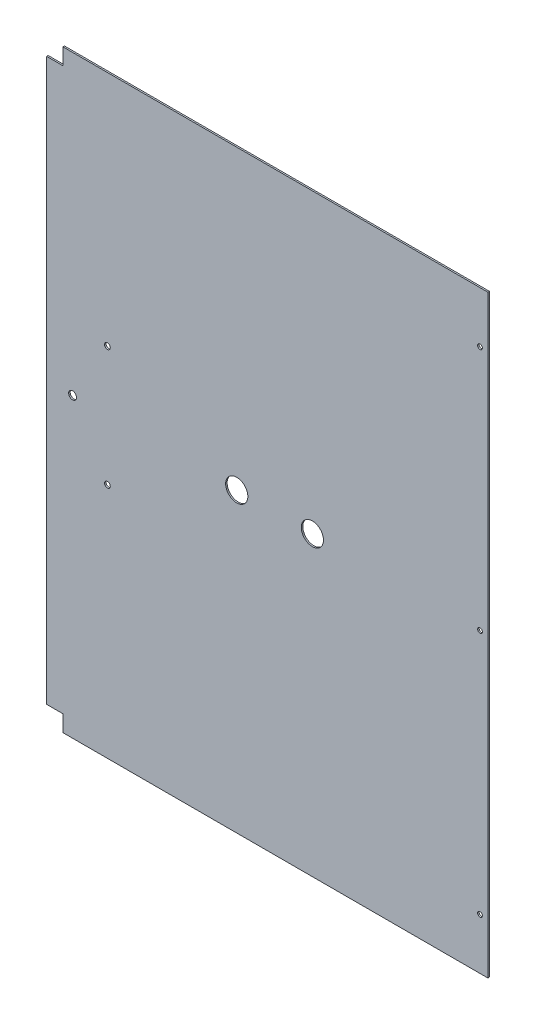
ISO-10303-21;
HEADER;
FILE_DESCRIPTION(('STEP AP214'),'2;1');
FILE_NAME('part.step','',(''),(''),'','','');
FILE_SCHEMA(('AUTOMOTIVE_DESIGN { 1 0 10303 214 1 1 1 1 }'));
ENDSEC;
DATA;
#1=APPLICATION_CONTEXT('core data for automotive mechanical design processes');
#2=APPLICATION_PROTOCOL_DEFINITION('international standard','automotive_design',2000,#1);
#3=PRODUCT_CONTEXT('',#1,'mechanical');
#4=PRODUCT('Part','Part','',(#3));
#5=PRODUCT_RELATED_PRODUCT_CATEGORY('part','',(#4));
#6=PRODUCT_DEFINITION_FORMATION('','',#4);
#7=PRODUCT_DEFINITION_CONTEXT('part definition',#1,'design');
#8=PRODUCT_DEFINITION('design','',#6,#7);
#9=PRODUCT_DEFINITION_SHAPE('','',#8);
#10=(LENGTH_UNIT() NAMED_UNIT(*) SI_UNIT(.MILLI.,.METRE.));
#11=(NAMED_UNIT(*) PLANE_ANGLE_UNIT() SI_UNIT($,.RADIAN.));
#12=(NAMED_UNIT(*) SI_UNIT($,.STERADIAN.) SOLID_ANGLE_UNIT());
#13=UNCERTAINTY_MEASURE_WITH_UNIT(LENGTH_MEASURE(1.E-05),#10,'distance_accuracy_value','');
#14=(GEOMETRIC_REPRESENTATION_CONTEXT(3) GLOBAL_UNCERTAINTY_ASSIGNED_CONTEXT((#13)) GLOBAL_UNIT_ASSIGNED_CONTEXT((#10,
#11,#12)) REPRESENTATION_CONTEXT('',''));
#15=CARTESIAN_POINT('',(0.,0.,0.));
#16=DIRECTION('',(0.,0.,1.));
#17=DIRECTION('',(1.,0.,0.));
#18=AXIS2_PLACEMENT_3D('',#15,#16,#17);
#19=CARTESIAN_POINT('',(0.,0.,-1.524));
#20=DIRECTION('',(0.,0.,-1.));
#21=DIRECTION('',(-1.,0.,0.));
#22=AXIS2_PLACEMENT_3D('',#19,#20,#21);
#23=PLANE('',#22);
#24=CARTESIAN_POINT('',(-202.819,0.,-1.524));
#25=DIRECTION('',(0.,0.,-1.));
#26=DIRECTION('',(-1.,0.,0.));
#27=AXIS2_PLACEMENT_3D('',#24,#25,#26);
#28=CIRCLE('',#27,3.9624);
#29=CARTESIAN_POINT('',(-206.7814,0.,-1.524));
#30=VERTEX_POINT('',#29);
#31=EDGE_CURVE('E311',#30,#30,#28,.T.);
#32=ORIENTED_EDGE('',*,*,#31,.F.);
#33=EDGE_LOOP('',(#32));
#34=FACE_BOUND('',#33,.T.);
#35=CARTESIAN_POINT('',(-167.767,60.452,-1.524));
#36=DIRECTION('',(0.,0.,-1.));
#37=DIRECTION('',(-1.,0.,0.));
#38=AXIS2_PLACEMENT_3D('',#35,#36,#37);
#39=CIRCLE('',#38,2.8956);
#40=CARTESIAN_POINT('',(-170.6626,60.452,-1.524));
#41=VERTEX_POINT('',#40);
#42=EDGE_CURVE('E435',#41,#41,#39,.T.);
#43=ORIENTED_EDGE('',*,*,#42,.F.);
#44=EDGE_LOOP('',(#43));
#45=FACE_BOUND('',#44,.T.);
#46=CARTESIAN_POINT('',(-167.767,-60.452,-1.524));
#47=DIRECTION('',(0.,0.,-1.));
#48=DIRECTION('',(-1.,0.,0.));
#49=AXIS2_PLACEMENT_3D('',#46,#47,#48);
#50=CIRCLE('',#49,2.8956);
#51=CARTESIAN_POINT('',(-170.6626,-60.452,-1.524));
#52=VERTEX_POINT('',#51);
#53=EDGE_CURVE('E431',#52,#52,#50,.T.);
#54=ORIENTED_EDGE('',*,*,#53,.F.);
#55=EDGE_LOOP('',(#54));
#56=FACE_BOUND('',#55,.T.);
#57=CARTESIAN_POINT('',(38.7349999999999,0.,-1.524));
#58=DIRECTION('',(0.,0.,-1.));
#59=DIRECTION('',(-1.,0.,0.));
#60=AXIS2_PLACEMENT_3D('',#57,#58,#59);
#61=CIRCLE('',#60,11.176);
#62=CARTESIAN_POINT('',(27.5589999999999,0.,-1.524));
#63=VERTEX_POINT('',#62);
#64=EDGE_CURVE('E427',#63,#63,#61,.T.);
#65=ORIENTED_EDGE('',*,*,#64,.F.);
#66=EDGE_LOOP('',(#65));
#67=FACE_BOUND('',#66,.T.);
#68=CARTESIAN_POINT('',(-37.4650000000002,0.,-1.524));
#69=DIRECTION('',(0.,0.,-1.));
#70=DIRECTION('',(-1.,0.,0.));
#71=AXIS2_PLACEMENT_3D('',#68,#69,#70);
#72=CIRCLE('',#71,11.176);
#73=CARTESIAN_POINT('',(-48.6410000000001,0.,-1.524));
#74=VERTEX_POINT('',#73);
#75=EDGE_CURVE('E423',#74,#74,#72,.T.);
#76=ORIENTED_EDGE('',*,*,#75,.F.);
#77=EDGE_LOOP('',(#76));
#78=FACE_BOUND('',#77,.T.);
#79=CARTESIAN_POINT('',(207.645,0.,-1.524));
#80=DIRECTION('',(0.,0.,-1.));
#81=DIRECTION('',(-1.,0.,0.));
#82=AXIS2_PLACEMENT_3D('',#79,#80,#81);
#83=CIRCLE('',#82,2.413);
#84=CARTESIAN_POINT('',(205.232,0.,-1.524));
#85=VERTEX_POINT('',#84);
#86=EDGE_CURVE('E419',#85,#85,#83,.T.);
#87=ORIENTED_EDGE('',*,*,#86,.F.);
#88=EDGE_LOOP('',(#87));
#89=FACE_BOUND('',#88,.T.);
#90=CARTESIAN_POINT('',(207.645,247.65,-1.524));
#91=DIRECTION('',(0.,0.,-1.));
#92=DIRECTION('',(-1.,0.,0.));
#93=AXIS2_PLACEMENT_3D('',#90,#91,#92);
#94=CIRCLE('',#93,2.413);
#95=CARTESIAN_POINT('',(205.232,247.65,-1.524));
#96=VERTEX_POINT('',#95);
#97=EDGE_CURVE('E415',#96,#96,#94,.T.);
#98=ORIENTED_EDGE('',*,*,#97,.F.);
#99=EDGE_LOOP('',(#98));
#100=FACE_BOUND('',#99,.T.);
#101=CARTESIAN_POINT('',(207.645,-247.65,-1.524));
#102=DIRECTION('',(0.,0.,-1.));
#103=DIRECTION('',(-1.,0.,0.));
#104=AXIS2_PLACEMENT_3D('',#101,#102,#103);
#105=CIRCLE('',#104,2.413);
#106=CARTESIAN_POINT('',(205.232,-247.65,-1.524));
#107=VERTEX_POINT('',#106);
#108=EDGE_CURVE('E384',#107,#107,#105,.T.);
#109=ORIENTED_EDGE('',*,*,#108,.F.);
#110=EDGE_LOOP('',(#109));
#111=FACE_BOUND('',#110,.T.);
#112=DIRECTION('',(0.,1.,0.));
#113=VECTOR('',#112,1.);
#114=CARTESIAN_POINT('',(215.519,-285.75,-1.524));
#115=LINE('',#114,#113);
#116=CARTESIAN_POINT('',(215.519,-299.198962531012,-1.52399999999991));
#117=VERTEX_POINT('',#116);
#118=CARTESIAN_POINT('',(215.519,299.198962531012,-1.52399999999986));
#119=VERTEX_POINT('',#118);
#120=EDGE_CURVE('E258',#117,#119,#115,.T.);
#121=ORIENTED_EDGE('',*,*,#120,.F.);
#122=DIRECTION('',(-1.,0.,0.));
#123=VECTOR('',#122,1.);
#124=CARTESIAN_POINT('',(0.,-299.198962531012,-1.52399999999991));
#125=LINE('',#124,#123);
#126=CARTESIAN_POINT('',(-212.471,-299.198962531012,-1.52399999999991));
#127=VERTEX_POINT('',#126);
#128=EDGE_CURVE('E367',#117,#127,#125,.T.);
#129=ORIENTED_EDGE('',*,*,#128,.T.);
#130=DIRECTION('',(0.,1.,0.));
#131=VECTOR('',#130,1.);
#132=CARTESIAN_POINT('',(-212.471,-284.473481265506,-1.52400000000006));
#133=LINE('',#132,#131);
#134=CARTESIAN_POINT('',(-212.471,-282.702,-1.52399999999998));
#135=VERTEX_POINT('',#134);
#136=EDGE_CURVE('E265',#127,#135,#133,.T.);
#137=ORIENTED_EDGE('',*,*,#136,.T.);
#138=DIRECTION('',(-1.,0.,0.));
#139=VECTOR('',#138,1.);
#140=CARTESIAN_POINT('',(-214.242481265506,-282.702,-1.52399999999998));
#141=LINE('',#140,#139);
#142=CARTESIAN_POINT('',(-228.967962531012,-282.702,-1.52399999999994));
#143=VERTEX_POINT('',#142);
#144=EDGE_CURVE('E272',#135,#143,#141,.T.);
#145=ORIENTED_EDGE('',*,*,#144,.T.);
#146=DIRECTION('',(0.,1.,0.));
#147=VECTOR('',#146,1.);
#148=CARTESIAN_POINT('',(-228.967962531012,0.,-1.52399999999991));
#149=LINE('',#148,#147);
#150=CARTESIAN_POINT('',(-228.967962531012,282.702,-1.52399999999989));
#151=VERTEX_POINT('',#150);
#152=EDGE_CURVE('E341',#143,#151,#149,.T.);
#153=ORIENTED_EDGE('',*,*,#152,.T.);
#154=DIRECTION('',(-1.,0.,0.));
#155=VECTOR('',#154,1.);
#156=CARTESIAN_POINT('',(-214.242481265506,282.702,-1.52399999999998));
#157=LINE('',#156,#155);
#158=CARTESIAN_POINT('',(-212.471,282.702,-1.52399999999998));
#159=VERTEX_POINT('',#158);
#160=EDGE_CURVE('E354',#151,#159,#157,.F.);
#161=ORIENTED_EDGE('',*,*,#160,.T.);
#162=DIRECTION('',(0.,1.,0.));
#163=VECTOR('',#162,1.);
#164=CARTESIAN_POINT('',(-212.471,284.473481265506,-1.52399999999998));
#165=LINE('',#164,#163);
#166=CARTESIAN_POINT('',(-212.471,299.198962531012,-1.52399999999986));
#167=VERTEX_POINT('',#166);
#168=EDGE_CURVE('E330',#159,#167,#165,.T.);
#169=ORIENTED_EDGE('',*,*,#168,.T.);
#170=DIRECTION('',(-1.,0.,0.));
#171=VECTOR('',#170,1.);
#172=CARTESIAN_POINT('',(0.,299.198962531012,-1.52399999999986));
#173=LINE('',#172,#171);
#174=EDGE_CURVE('E319',#167,#119,#173,.F.);
#175=ORIENTED_EDGE('',*,*,#174,.T.);
#176=EDGE_LOOP('',(#121,#129,#137,#145,#153,#161,#169,#175));
#177=FACE_BOUND('',#176,.T.);
#178=ADVANCED_FACE('F227',(#34,#45,#56,#67,#78,#89,#100,#111,#177),#23,.T.);
#179=CARTESIAN_POINT('',(0.,0.,0.));
#180=DIRECTION('',(0.,0.,-1.));
#181=DIRECTION('',(-1.,0.,0.));
#182=AXIS2_PLACEMENT_3D('',#179,#180,#181);
#183=PLANE('',#182);
#184=CARTESIAN_POINT('',(-202.819,0.,0.));
#185=DIRECTION('',(0.,0.,1.));
#186=DIRECTION('',(1.,0.,0.));
#187=AXIS2_PLACEMENT_3D('',#184,#185,#186);
#188=CIRCLE('',#187,3.9624);
#189=CARTESIAN_POINT('',(-198.8566,0.,0.));
#190=VERTEX_POINT('',#189);
#191=EDGE_CURVE('E380',#190,#190,#188,.T.);
#192=ORIENTED_EDGE('',*,*,#191,.F.);
#193=EDGE_LOOP('',(#192));
#194=FACE_BOUND('',#193,.T.);
#195=CARTESIAN_POINT('',(-167.767,60.452,0.));
#196=DIRECTION('',(0.,0.,1.));
#197=DIRECTION('',(1.,0.,0.));
#198=AXIS2_PLACEMENT_3D('',#195,#196,#197);
#199=CIRCLE('',#198,2.8956);
#200=CARTESIAN_POINT('',(-164.8714,60.452,0.));
#201=VERTEX_POINT('',#200);
#202=EDGE_CURVE('E385',#201,#201,#199,.T.);
#203=ORIENTED_EDGE('',*,*,#202,.F.);
#204=EDGE_LOOP('',(#203));
#205=FACE_BOUND('',#204,.T.);
#206=CARTESIAN_POINT('',(-167.767,-60.452,0.));
#207=DIRECTION('',(0.,0.,1.));
#208=DIRECTION('',(1.,0.,0.));
#209=AXIS2_PLACEMENT_3D('',#206,#207,#208);
#210=CIRCLE('',#209,2.8956);
#211=CARTESIAN_POINT('',(-164.8714,-60.452,0.));
#212=VERTEX_POINT('',#211);
#213=EDGE_CURVE('E389',#212,#212,#210,.T.);
#214=ORIENTED_EDGE('',*,*,#213,.F.);
#215=EDGE_LOOP('',(#214));
#216=FACE_BOUND('',#215,.T.);
#217=CARTESIAN_POINT('',(38.7349999999999,0.,0.));
#218=DIRECTION('',(0.,0.,1.));
#219=DIRECTION('',(1.,0.,0.));
#220=AXIS2_PLACEMENT_3D('',#217,#218,#219);
#221=CIRCLE('',#220,11.176);
#222=CARTESIAN_POINT('',(49.9109999999999,0.,0.));
#223=VERTEX_POINT('',#222);
#224=EDGE_CURVE('E393',#223,#223,#221,.T.);
#225=ORIENTED_EDGE('',*,*,#224,.F.);
#226=EDGE_LOOP('',(#225));
#227=FACE_BOUND('',#226,.T.);
#228=CARTESIAN_POINT('',(-37.4650000000002,0.,0.));
#229=DIRECTION('',(0.,0.,1.));
#230=DIRECTION('',(1.,0.,0.));
#231=AXIS2_PLACEMENT_3D('',#228,#229,#230);
#232=CIRCLE('',#231,11.176);
#233=CARTESIAN_POINT('',(-26.2890000000002,0.,0.));
#234=VERTEX_POINT('',#233);
#235=EDGE_CURVE('E397',#234,#234,#232,.T.);
#236=ORIENTED_EDGE('',*,*,#235,.F.);
#237=EDGE_LOOP('',(#236));
#238=FACE_BOUND('',#237,.T.);
#239=CARTESIAN_POINT('',(207.645,0.,0.));
#240=DIRECTION('',(0.,0.,1.));
#241=DIRECTION('',(1.,0.,0.));
#242=AXIS2_PLACEMENT_3D('',#239,#240,#241);
#243=CIRCLE('',#242,2.413);
#244=CARTESIAN_POINT('',(210.058,0.,0.));
#245=VERTEX_POINT('',#244);
#246=EDGE_CURVE('E401',#245,#245,#243,.T.);
#247=ORIENTED_EDGE('',*,*,#246,.F.);
#248=EDGE_LOOP('',(#247));
#249=FACE_BOUND('',#248,.T.);
#250=CARTESIAN_POINT('',(207.645,247.65,0.));
#251=DIRECTION('',(0.,0.,1.));
#252=DIRECTION('',(1.,0.,0.));
#253=AXIS2_PLACEMENT_3D('',#250,#251,#252);
#254=CIRCLE('',#253,2.413);
#255=CARTESIAN_POINT('',(210.058,247.65,0.));
#256=VERTEX_POINT('',#255);
#257=EDGE_CURVE('E405',#256,#256,#254,.T.);
#258=ORIENTED_EDGE('',*,*,#257,.F.);
#259=EDGE_LOOP('',(#258));
#260=FACE_BOUND('',#259,.T.);
#261=CARTESIAN_POINT('',(207.645,-247.65,0.));
#262=DIRECTION('',(0.,0.,1.));
#263=DIRECTION('',(1.,0.,0.));
#264=AXIS2_PLACEMENT_3D('',#261,#262,#263);
#265=CIRCLE('',#264,2.413);
#266=CARTESIAN_POINT('',(210.058,-247.65,0.));
#267=VERTEX_POINT('',#266);
#268=EDGE_CURVE('E377',#267,#267,#265,.T.);
#269=ORIENTED_EDGE('',*,*,#268,.F.);
#270=EDGE_LOOP('',(#269));
#271=FACE_BOUND('',#270,.T.);
#272=DIRECTION('',(-1.,0.,0.));
#273=VECTOR('',#272,1.);
#274=CARTESIAN_POINT('',(-214.242481265506,-282.702,0.));
#275=LINE('',#274,#273);
#276=CARTESIAN_POINT('',(-212.471,-282.702,0.));
#277=VERTEX_POINT('',#276);
#278=CARTESIAN_POINT('',(-228.967962531012,-282.702,0.));
#279=VERTEX_POINT('',#278);
#280=EDGE_CURVE('E340',#277,#279,#275,.T.);
#281=ORIENTED_EDGE('',*,*,#280,.F.);
#282=DIRECTION('',(0.,1.,0.));
#283=VECTOR('',#282,1.);
#284=CARTESIAN_POINT('',(-212.471,-284.473481265506,0.));
#285=LINE('',#284,#283);
#286=CARTESIAN_POINT('',(-212.471,-299.198962531012,1.11022302462516E-13));
#287=VERTEX_POINT('',#286);
#288=EDGE_CURVE('E245',#287,#277,#285,.T.);
#289=ORIENTED_EDGE('',*,*,#288,.F.);
#290=DIRECTION('',(1.,0.,0.));
#291=VECTOR('',#290,1.);
#292=CARTESIAN_POINT('',(215.519,-299.198962531012,1.11022302462516E-13));
#293=LINE('',#292,#291);
#294=CARTESIAN_POINT('',(215.519,-299.198962531012,1.11022302462516E-13));
#295=VERTEX_POINT('',#294);
#296=EDGE_CURVE('E307',#295,#287,#293,.F.);
#297=ORIENTED_EDGE('',*,*,#296,.F.);
#298=DIRECTION('',(0.,1.,0.));
#299=VECTOR('',#298,1.);
#300=CARTESIAN_POINT('',(215.519,-285.75,0.));
#301=LINE('',#300,#299);
#302=CARTESIAN_POINT('',(215.519,299.198962531012,1.66533453693773E-13));
#303=VERTEX_POINT('',#302);
#304=EDGE_CURVE('E301',#295,#303,#301,.T.);
#305=ORIENTED_EDGE('',*,*,#304,.T.);
#306=DIRECTION('',(1.,0.,0.));
#307=VECTOR('',#306,1.);
#308=CARTESIAN_POINT('',(215.519,299.198962531012,1.66533453693773E-13));
#309=LINE('',#308,#307);
#310=CARTESIAN_POINT('',(-212.471,299.198962531012,1.66533453693773E-13));
#311=VERTEX_POINT('',#310);
#312=EDGE_CURVE('E305',#311,#303,#309,.T.);
#313=ORIENTED_EDGE('',*,*,#312,.F.);
#314=DIRECTION('',(0.,1.,0.));
#315=VECTOR('',#314,1.);
#316=CARTESIAN_POINT('',(-212.471,284.473481265506,0.));
#317=LINE('',#316,#315);
#318=CARTESIAN_POINT('',(-212.471,282.702,0.));
#319=VERTEX_POINT('',#318);
#320=EDGE_CURVE('E334',#319,#311,#317,.T.);
#321=ORIENTED_EDGE('',*,*,#320,.F.);
#322=DIRECTION('',(-1.,0.,0.));
#323=VECTOR('',#322,1.);
#324=CARTESIAN_POINT('',(-214.242481265506,282.702,0.));
#325=LINE('',#324,#323);
#326=CARTESIAN_POINT('',(-228.967962531012,282.702,1.38777878078145E-13));
#327=VERTEX_POINT('',#326);
#328=EDGE_CURVE('E355',#327,#319,#325,.F.);
#329=ORIENTED_EDGE('',*,*,#328,.F.);
#330=DIRECTION('',(0.,-1.,0.));
#331=VECTOR('',#330,1.);
#332=CARTESIAN_POINT('',(-228.967962531012,-282.702,0.));
#333=LINE('',#332,#331);
#334=EDGE_CURVE('E333',#279,#327,#333,.F.);
#335=ORIENTED_EDGE('',*,*,#334,.F.);
#336=EDGE_LOOP('',(#281,#289,#297,#305,#313,#321,#329,#335));
#337=FACE_BOUND('',#336,.T.);
#338=ADVANCED_FACE('F229',(#194,#205,#216,#227,#238,#249,#260,#271,#337),#183,.F.);
#339=CARTESIAN_POINT('',(215.519,-285.75,-1.524));
#340=DIRECTION('',(1.,0.,0.));
#341=DIRECTION('',(0.,0.,-1.));
#342=AXIS2_PLACEMENT_3D('',#339,#340,#341);
#343=PLANE('',#342);
#344=ORIENTED_EDGE('',*,*,#304,.F.);
#345=DIRECTION('',(0.,0.,-1.));
#346=VECTOR('',#345,1.);
#347=CARTESIAN_POINT('',(215.519,-299.198962531012,1.11022302462516E-13));
#348=LINE('',#347,#346);
#349=EDGE_CURVE('E364',#295,#117,#348,.T.);
#350=ORIENTED_EDGE('',*,*,#349,.T.);
#351=ORIENTED_EDGE('',*,*,#120,.T.);
#352=DIRECTION('',(0.,0.,-1.));
#353=VECTOR('',#352,1.);
#354=CARTESIAN_POINT('',(215.519,299.198962531012,1.66533453693773E-13));
#355=LINE('',#354,#353);
#356=EDGE_CURVE('E314',#303,#119,#355,.T.);
#357=ORIENTED_EDGE('',*,*,#356,.F.);
#358=EDGE_LOOP('',(#344,#350,#351,#357));
#359=FACE_BOUND('',#358,.T.);
#360=ADVANCED_FACE('F315',(#359),#343,.T.);
#361=CARTESIAN_POINT('',(207.645,-247.65,-16.002));
#362=DIRECTION('',(0.,0.,1.));
#363=DIRECTION('',(1.,0.,0.));
#364=AXIS2_PLACEMENT_3D('',#361,#362,#363);
#365=CYLINDRICAL_SURFACE('',#364,2.413);
#366=ORIENTED_EDGE('',*,*,#108,.T.);
#367=EDGE_LOOP('',(#366));
#368=FACE_BOUND('',#367,.T.);
#369=ORIENTED_EDGE('',*,*,#268,.T.);
#370=EDGE_LOOP('',(#369));
#371=FACE_BOUND('',#370,.T.);
#372=ADVANCED_FACE('F493',(#368,#371),#365,.F.);
#373=CARTESIAN_POINT('',(207.645,247.65,-16.002));
#374=DIRECTION('',(0.,0.,1.));
#375=DIRECTION('',(1.,0.,0.));
#376=AXIS2_PLACEMENT_3D('',#373,#374,#375);
#377=CYLINDRICAL_SURFACE('',#376,2.413);
#378=ORIENTED_EDGE('',*,*,#97,.T.);
#379=EDGE_LOOP('',(#378));
#380=FACE_BOUND('',#379,.T.);
#381=ORIENTED_EDGE('',*,*,#257,.T.);
#382=EDGE_LOOP('',(#381));
#383=FACE_BOUND('',#382,.T.);
#384=ADVANCED_FACE('F499',(#380,#383),#377,.F.);
#385=CARTESIAN_POINT('',(207.645,0.,-16.002));
#386=DIRECTION('',(0.,0.,1.));
#387=DIRECTION('',(1.,0.,0.));
#388=AXIS2_PLACEMENT_3D('',#385,#386,#387);
#389=CYLINDRICAL_SURFACE('',#388,2.413);
#390=ORIENTED_EDGE('',*,*,#86,.T.);
#391=EDGE_LOOP('',(#390));
#392=FACE_BOUND('',#391,.T.);
#393=ORIENTED_EDGE('',*,*,#246,.T.);
#394=EDGE_LOOP('',(#393));
#395=FACE_BOUND('',#394,.T.);
#396=ADVANCED_FACE('F504',(#392,#395),#389,.F.);
#397=CARTESIAN_POINT('',(-37.4650000000002,0.,-16.002));
#398=DIRECTION('',(0.,0.,1.));
#399=DIRECTION('',(1.,0.,0.));
#400=AXIS2_PLACEMENT_3D('',#397,#398,#399);
#401=CYLINDRICAL_SURFACE('',#400,11.176);
#402=ORIENTED_EDGE('',*,*,#75,.T.);
#403=EDGE_LOOP('',(#402));
#404=FACE_BOUND('',#403,.T.);
#405=ORIENTED_EDGE('',*,*,#235,.T.);
#406=EDGE_LOOP('',(#405));
#407=FACE_BOUND('',#406,.T.);
#408=ADVANCED_FACE('F514',(#404,#407),#401,.F.);
#409=CARTESIAN_POINT('',(38.7349999999999,0.,-16.002));
#410=DIRECTION('',(0.,0.,1.));
#411=DIRECTION('',(1.,0.,0.));
#412=AXIS2_PLACEMENT_3D('',#409,#410,#411);
#413=CYLINDRICAL_SURFACE('',#412,11.176);
#414=ORIENTED_EDGE('',*,*,#64,.T.);
#415=EDGE_LOOP('',(#414));
#416=FACE_BOUND('',#415,.T.);
#417=ORIENTED_EDGE('',*,*,#224,.T.);
#418=EDGE_LOOP('',(#417));
#419=FACE_BOUND('',#418,.T.);
#420=ADVANCED_FACE('F521',(#416,#419),#413,.F.);
#421=CARTESIAN_POINT('',(-167.767,-60.452,-16.002));
#422=DIRECTION('',(0.,0.,1.));
#423=DIRECTION('',(1.,0.,0.));
#424=AXIS2_PLACEMENT_3D('',#421,#422,#423);
#425=CYLINDRICAL_SURFACE('',#424,2.8956);
#426=ORIENTED_EDGE('',*,*,#53,.T.);
#427=EDGE_LOOP('',(#426));
#428=FACE_BOUND('',#427,.T.);
#429=ORIENTED_EDGE('',*,*,#213,.T.);
#430=EDGE_LOOP('',(#429));
#431=FACE_BOUND('',#430,.T.);
#432=ADVANCED_FACE('F525',(#428,#431),#425,.F.);
#433=CARTESIAN_POINT('',(-167.767,60.452,-16.002));
#434=DIRECTION('',(0.,0.,1.));
#435=DIRECTION('',(1.,0.,0.));
#436=AXIS2_PLACEMENT_3D('',#433,#434,#435);
#437=CYLINDRICAL_SURFACE('',#436,2.8956);
#438=ORIENTED_EDGE('',*,*,#42,.T.);
#439=EDGE_LOOP('',(#438));
#440=FACE_BOUND('',#439,.T.);
#441=ORIENTED_EDGE('',*,*,#202,.T.);
#442=EDGE_LOOP('',(#441));
#443=FACE_BOUND('',#442,.T.);
#444=ADVANCED_FACE('F529',(#440,#443),#437,.F.);
#445=CARTESIAN_POINT('',(-202.819,0.,-16.002));
#446=DIRECTION('',(0.,0.,1.));
#447=DIRECTION('',(1.,0.,0.));
#448=AXIS2_PLACEMENT_3D('',#445,#446,#447);
#449=CYLINDRICAL_SURFACE('',#448,3.9624);
#450=ORIENTED_EDGE('',*,*,#31,.T.);
#451=EDGE_LOOP('',(#450));
#452=FACE_BOUND('',#451,.T.);
#453=ORIENTED_EDGE('',*,*,#191,.T.);
#454=EDGE_LOOP('',(#453));
#455=FACE_BOUND('',#454,.T.);
#456=ADVANCED_FACE('F533',(#452,#455),#449,.F.);
#457=CARTESIAN_POINT('',(-212.471,-284.473481265506,-0.792480000000056));
#458=DIRECTION('',(-1.,0.,0.));
#459=DIRECTION('',(0.,1.,0.));
#460=AXIS2_PLACEMENT_3D('',#457,#458,#459);
#461=PLANE('',#460);
#462=ORIENTED_EDGE('',*,*,#288,.T.);
#463=DIRECTION('',(0.,0.,1.));
#464=VECTOR('',#463,1.);
#465=CARTESIAN_POINT('',(-212.471,-282.702,-1.52400000000006));
#466=LINE('',#465,#464);
#467=EDGE_CURVE('E237',#135,#277,#466,.T.);
#468=ORIENTED_EDGE('',*,*,#467,.F.);
#469=ORIENTED_EDGE('',*,*,#136,.F.);
#470=DIRECTION('',(0.,0.,-1.));
#471=VECTOR('',#470,1.);
#472=CARTESIAN_POINT('',(-212.471,-299.198962531012,1.11022302462516E-13));
#473=LINE('',#472,#471);
#474=EDGE_CURVE('E370',#287,#127,#473,.T.);
#475=ORIENTED_EDGE('',*,*,#474,.F.);
#476=EDGE_LOOP('',(#462,#468,#469,#475));
#477=FACE_BOUND('',#476,.T.);
#478=ADVANCED_FACE('F448',(#477),#461,.T.);
#479=CARTESIAN_POINT('',(215.519,-299.198962531012,1.11022302462516E-13));
#480=DIRECTION('',(0.,-1.,0.));
#481=DIRECTION('',(0.,0.,-1.));
#482=AXIS2_PLACEMENT_3D('',#479,#480,#481);
#483=PLANE('',#482);
#484=ORIENTED_EDGE('',*,*,#128,.F.);
#485=ORIENTED_EDGE('',*,*,#349,.F.);
#486=ORIENTED_EDGE('',*,*,#296,.T.);
#487=ORIENTED_EDGE('',*,*,#474,.T.);
#488=EDGE_LOOP('',(#484,#485,#486,#487));
#489=FACE_BOUND('',#488,.T.);
#490=ADVANCED_FACE('F451',(#489),#483,.T.);
#491=CARTESIAN_POINT('',(-214.242481265506,-282.702,-0.792479999999976));
#492=DIRECTION('',(0.,-1.,0.));
#493=DIRECTION('',(-1.,0.,0.));
#494=AXIS2_PLACEMENT_3D('',#491,#492,#493);
#495=PLANE('',#494);
#496=ORIENTED_EDGE('',*,*,#467,.T.);
#497=ORIENTED_EDGE('',*,*,#280,.T.);
#498=DIRECTION('',(0.,0.,-1.));
#499=VECTOR('',#498,1.);
#500=CARTESIAN_POINT('',(-228.967962531012,-282.702,0.));
#501=LINE('',#500,#499);
#502=EDGE_CURVE('E337',#279,#143,#501,.T.);
#503=ORIENTED_EDGE('',*,*,#502,.T.);
#504=ORIENTED_EDGE('',*,*,#144,.F.);
#505=EDGE_LOOP('',(#496,#497,#503,#504));
#506=FACE_BOUND('',#505,.T.);
#507=ADVANCED_FACE('F445',(#506),#495,.T.);
#508=CARTESIAN_POINT('',(-214.242481265506,282.702,-0.792479999999976));
#509=DIRECTION('',(0.,-1.,0.));
#510=DIRECTION('',(-1.,0.,0.));
#511=AXIS2_PLACEMENT_3D('',#508,#509,#510);
#512=PLANE('',#511);
#513=ORIENTED_EDGE('',*,*,#328,.T.);
#514=DIRECTION('',(0.,0.,1.));
#515=VECTOR('',#514,1.);
#516=CARTESIAN_POINT('',(-212.471,282.702,-1.52399999999998));
#517=LINE('',#516,#515);
#518=EDGE_CURVE('E13',#159,#319,#517,.T.);
#519=ORIENTED_EDGE('',*,*,#518,.F.);
#520=ORIENTED_EDGE('',*,*,#160,.F.);
#521=DIRECTION('',(0.,0.,-1.));
#522=VECTOR('',#521,1.);
#523=CARTESIAN_POINT('',(-228.967962531012,282.702,1.11022302462516E-13));
#524=LINE('',#523,#522);
#525=EDGE_CURVE('E345',#327,#151,#524,.T.);
#526=ORIENTED_EDGE('',*,*,#525,.F.);
#527=EDGE_LOOP('',(#513,#519,#520,#526));
#528=FACE_BOUND('',#527,.T.);
#529=ADVANCED_FACE('F457',(#528),#512,.F.);
#530=CARTESIAN_POINT('',(-228.967962531012,-282.702,0.));
#531=DIRECTION('',(-1.,0.,0.));
#532=DIRECTION('',(0.,0.,1.));
#533=AXIS2_PLACEMENT_3D('',#530,#531,#532);
#534=PLANE('',#533);
#535=ORIENTED_EDGE('',*,*,#152,.F.);
#536=ORIENTED_EDGE('',*,*,#502,.F.);
#537=ORIENTED_EDGE('',*,*,#334,.T.);
#538=ORIENTED_EDGE('',*,*,#525,.T.);
#539=EDGE_LOOP('',(#535,#536,#537,#538));
#540=FACE_BOUND('',#539,.T.);
#541=ADVANCED_FACE('F454',(#540),#534,.T.);
#542=CARTESIAN_POINT('',(-212.471,284.473481265506,-0.792479999999976));
#543=DIRECTION('',(-1.,0.,0.));
#544=DIRECTION('',(0.,1.,0.));
#545=AXIS2_PLACEMENT_3D('',#542,#543,#544);
#546=PLANE('',#545);
#547=ORIENTED_EDGE('',*,*,#518,.T.);
#548=ORIENTED_EDGE('',*,*,#320,.T.);
#549=DIRECTION('',(0.,0.,-1.));
#550=VECTOR('',#549,1.);
#551=CARTESIAN_POINT('',(-212.471,299.198962531012,1.66533453693773E-13));
#552=LINE('',#551,#550);
#553=EDGE_CURVE('E324',#311,#167,#552,.T.);
#554=ORIENTED_EDGE('',*,*,#553,.T.);
#555=ORIENTED_EDGE('',*,*,#168,.F.);
#556=EDGE_LOOP('',(#547,#548,#554,#555));
#557=FACE_BOUND('',#556,.T.);
#558=ADVANCED_FACE('F460',(#557),#546,.T.);
#559=CARTESIAN_POINT('',(215.519,299.198962531012,1.66533453693773E-13));
#560=DIRECTION('',(0.,1.,0.));
#561=DIRECTION('',(0.,0.,1.));
#562=AXIS2_PLACEMENT_3D('',#559,#560,#561);
#563=PLANE('',#562);
#564=ORIENTED_EDGE('',*,*,#174,.F.);
#565=ORIENTED_EDGE('',*,*,#553,.F.);
#566=ORIENTED_EDGE('',*,*,#312,.T.);
#567=ORIENTED_EDGE('',*,*,#356,.T.);
#568=EDGE_LOOP('',(#564,#565,#566,#567));
#569=FACE_BOUND('',#568,.T.);
#570=ADVANCED_FACE('F322',(#569),#563,.T.);
#571=CLOSED_SHELL('',(#178,#338,#360,#372,#384,#396,#408,#420,#432,#444,#456,#478,#490,#507,
#529,#541,#558,#570));
#572=MANIFOLD_SOLID_BREP('B2',#571);
#573=ADVANCED_BREP_SHAPE_REPRESENTATION('',(#18,#572),#14);
#574=SHAPE_DEFINITION_REPRESENTATION(#9,#573);
ENDSEC;
END-ISO-10303-21;
